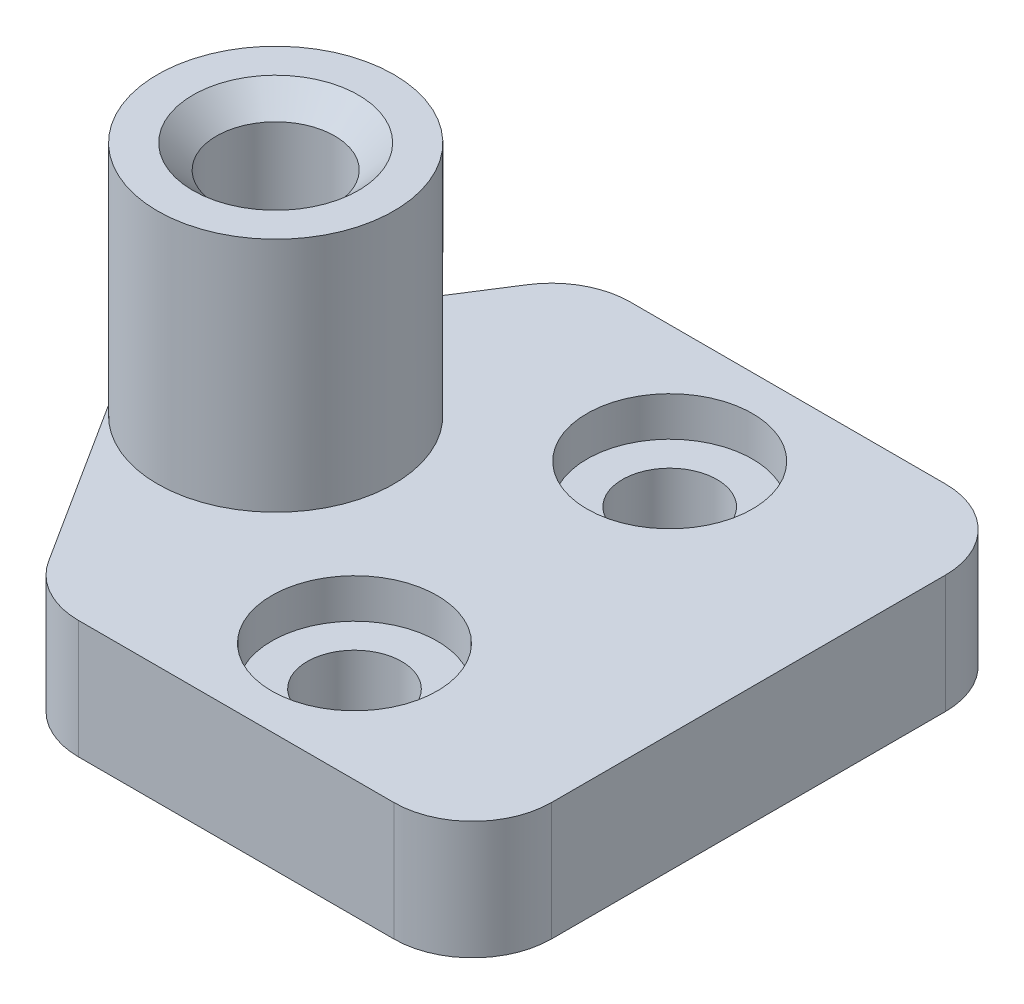
ISO-10303-21;
HEADER;
FILE_DESCRIPTION(('STEP AP214'),'2;1');
FILE_NAME('part.step','',(''),(''),'','','');
FILE_SCHEMA(('AUTOMOTIVE_DESIGN { 1 0 10303 214 1 1 1 1 }'));
ENDSEC;
DATA;
#1=APPLICATION_CONTEXT('core data for automotive mechanical design processes');
#2=APPLICATION_PROTOCOL_DEFINITION('international standard','automotive_design',2000,#1);
#3=PRODUCT_CONTEXT('',#1,'mechanical');
#4=PRODUCT('Part','Part','',(#3));
#5=PRODUCT_RELATED_PRODUCT_CATEGORY('part','',(#4));
#6=PRODUCT_DEFINITION_FORMATION('','',#4);
#7=PRODUCT_DEFINITION_CONTEXT('part definition',#1,'design');
#8=PRODUCT_DEFINITION('design','',#6,#7);
#9=PRODUCT_DEFINITION_SHAPE('','',#8);
#10=(LENGTH_UNIT() NAMED_UNIT(*) SI_UNIT(.MILLI.,.METRE.));
#11=(NAMED_UNIT(*) PLANE_ANGLE_UNIT() SI_UNIT($,.RADIAN.));
#12=(NAMED_UNIT(*) SI_UNIT($,.STERADIAN.) SOLID_ANGLE_UNIT());
#13=UNCERTAINTY_MEASURE_WITH_UNIT(LENGTH_MEASURE(1.E-05),#10,'distance_accuracy_value','');
#14=(GEOMETRIC_REPRESENTATION_CONTEXT(3) GLOBAL_UNCERTAINTY_ASSIGNED_CONTEXT((#13)) GLOBAL_UNIT_ASSIGNED_CONTEXT((#10,
#11,#12)) REPRESENTATION_CONTEXT('',''));
#15=CARTESIAN_POINT('',(0.,0.,0.));
#16=DIRECTION('',(0.,0.,1.));
#17=DIRECTION('',(1.,0.,0.));
#18=AXIS2_PLACEMENT_3D('',#15,#16,#17);
#19=CARTESIAN_POINT('',(0.,3.,-4.));
#20=DIRECTION('',(0.,-1.,0.));
#21=DIRECTION('',(0.,0.,-1.));
#22=AXIS2_PLACEMENT_3D('',#19,#20,#21);
#23=CYLINDRICAL_SURFACE('',#22,1.2);
#24=CARTESIAN_POINT('',(0.,0.,-4.));
#25=DIRECTION('',(0.,1.,0.));
#26=DIRECTION('',(0.,0.,1.));
#27=AXIS2_PLACEMENT_3D('',#24,#25,#26);
#28=CIRCLE('',#27,1.2);
#29=CARTESIAN_POINT('',(0.,0.,-2.8));
#30=VERTEX_POINT('',#29);
#31=EDGE_CURVE('E276',#30,#30,#28,.T.);
#32=ORIENTED_EDGE('',*,*,#31,.F.);
#33=EDGE_LOOP('',(#32));
#34=FACE_BOUND('',#33,.T.);
#35=CARTESIAN_POINT('',(0.,2.,-4.));
#36=DIRECTION('',(0.,1.,0.));
#37=DIRECTION('',(0.,0.,1.));
#38=AXIS2_PLACEMENT_3D('',#35,#36,#37);
#39=CIRCLE('',#38,1.2);
#40=CARTESIAN_POINT('',(0.,2.,-2.8));
#41=VERTEX_POINT('',#40);
#42=EDGE_CURVE('E158',#41,#41,#39,.T.);
#43=ORIENTED_EDGE('',*,*,#42,.T.);
#44=EDGE_LOOP('',(#43));
#45=FACE_BOUND('',#44,.T.);
#46=ADVANCED_FACE('F41',(#34,#45),#23,.F.);
#47=CARTESIAN_POINT('',(0.,3.,4.));
#48=DIRECTION('',(0.,-1.,0.));
#49=DIRECTION('',(0.,0.,-1.));
#50=AXIS2_PLACEMENT_3D('',#47,#48,#49);
#51=CYLINDRICAL_SURFACE('',#50,1.2);
#52=CARTESIAN_POINT('',(0.,0.,4.));
#53=DIRECTION('',(0.,1.,0.));
#54=DIRECTION('',(0.,0.,1.));
#55=AXIS2_PLACEMENT_3D('',#52,#53,#54);
#56=CIRCLE('',#55,1.2);
#57=CARTESIAN_POINT('',(0.,0.,5.2));
#58=VERTEX_POINT('',#57);
#59=EDGE_CURVE('E282',#58,#58,#56,.T.);
#60=ORIENTED_EDGE('',*,*,#59,.F.);
#61=EDGE_LOOP('',(#60));
#62=FACE_BOUND('',#61,.T.);
#63=CARTESIAN_POINT('',(0.,2.,4.));
#64=DIRECTION('',(0.,1.,0.));
#65=DIRECTION('',(0.,0.,1.));
#66=AXIS2_PLACEMENT_3D('',#63,#64,#65);
#67=CIRCLE('',#66,1.2);
#68=CARTESIAN_POINT('',(0.,2.,5.2));
#69=VERTEX_POINT('',#68);
#70=EDGE_CURVE('E155',#69,#69,#67,.T.);
#71=ORIENTED_EDGE('',*,*,#70,.T.);
#72=EDGE_LOOP('',(#71));
#73=FACE_BOUND('',#72,.T.);
#74=ADVANCED_FACE('F179',(#62,#73),#51,.F.);
#75=CARTESIAN_POINT('',(-6.,-8.48528137423857,0.));
#76=DIRECTION('',(0.,1.,0.));
#77=DIRECTION('',(0.,0.,1.));
#78=AXIS2_PLACEMENT_3D('',#75,#76,#77);
#79=CYLINDRICAL_SURFACE('',#78,3.);
#80=CARTESIAN_POINT('',(-6.,9.,0.));
#81=DIRECTION('',(0.,1.,0.));
#82=DIRECTION('',(0.,0.,1.));
#83=AXIS2_PLACEMENT_3D('',#80,#81,#82);
#84=CIRCLE('',#83,3.);
#85=CARTESIAN_POINT('',(-6.,9.,3.));
#86=VERTEX_POINT('',#85);
#87=EDGE_CURVE('E289',#86,#86,#84,.T.);
#88=ORIENTED_EDGE('',*,*,#87,.F.);
#89=EDGE_LOOP('',(#88));
#90=FACE_BOUND('',#89,.T.);
#91=CARTESIAN_POINT('',(-6.,3.,0.));
#92=DIRECTION('',(0.,1.,0.));
#93=DIRECTION('',(0.,0.,1.));
#94=AXIS2_PLACEMENT_3D('',#91,#92,#93);
#95=CIRCLE('',#94,3.);
#96=CARTESIAN_POINT('',(-8.53008756317027,3.,1.61203502526811));
#97=VERTEX_POINT('',#96);
#98=CARTESIAN_POINT('',(-8.53008756317027,3.,-1.61203502526811));
#99=VERTEX_POINT('',#98);
#100=EDGE_CURVE('E285',#97,#99,#95,.T.);
#101=ORIENTED_EDGE('',*,*,#100,.T.);
#102=DIRECTION('',(0.,1.,0.));
#103=VECTOR('',#102,1.);
#104=CARTESIAN_POINT('',(-8.53008756317027,-5.29150262212918,-1.61203502526811));
#105=LINE('',#104,#103);
#106=CARTESIAN_POINT('',(-8.53008756317027,0.,-1.61203502526811));
#107=VERTEX_POINT('',#106);
#108=EDGE_CURVE('E123',#107,#99,#105,.T.);
#109=ORIENTED_EDGE('',*,*,#108,.F.);
#110=CARTESIAN_POINT('',(-6.,0.,0.));
#111=DIRECTION('',(0.,1.,0.));
#112=DIRECTION('',(0.,0.,1.));
#113=AXIS2_PLACEMENT_3D('',#110,#111,#112);
#114=CIRCLE('',#113,3.);
#115=CARTESIAN_POINT('',(-8.53008756317027,0.,1.61203502526811));
#116=VERTEX_POINT('',#115);
#117=EDGE_CURVE('E287',#116,#107,#114,.F.);
#118=ORIENTED_EDGE('',*,*,#117,.F.);
#119=DIRECTION('',(0.,1.,0.));
#120=VECTOR('',#119,1.);
#121=CARTESIAN_POINT('',(-8.53008756317027,-5.29150262212918,1.61203502526811));
#122=LINE('',#121,#120);
#123=EDGE_CURVE('E239',#116,#97,#122,.T.);
#124=ORIENTED_EDGE('',*,*,#123,.T.);
#125=EDGE_LOOP('',(#101,#109,#118,#124));
#126=FACE_BOUND('',#125,.T.);
#127=ADVANCED_FACE('F186',(#90,#126),#79,.T.);
#128=CARTESIAN_POINT('',(-4.,3.,-5.));
#129=DIRECTION('',(0.,-1.,0.));
#130=DIRECTION('',(0.,0.,-1.));
#131=AXIS2_PLACEMENT_3D('',#128,#129,#130);
#132=CYLINDRICAL_SURFACE('',#131,2.);
#133=CARTESIAN_POINT('',(-4.,0.,-5.));
#134=DIRECTION('',(0.,1.,0.));
#135=DIRECTION('',(0.,0.,1.));
#136=AXIS2_PLACEMENT_3D('',#133,#134,#135);
#137=CIRCLE('',#136,2.);
#138=CARTESIAN_POINT('',(-5.68672504211351,0.,-6.07469001684541));
#139=VERTEX_POINT('',#138);
#140=CARTESIAN_POINT('',(-4.,0.,-7.));
#141=VERTEX_POINT('',#140);
#142=EDGE_CURVE('E134',#139,#141,#137,.F.);
#143=ORIENTED_EDGE('',*,*,#142,.F.);
#144=DIRECTION('',(0.,1.,0.));
#145=VECTOR('',#144,1.);
#146=CARTESIAN_POINT('',(-5.68672504211351,-5.29150262212918,-6.0746900168454));
#147=LINE('',#146,#145);
#148=CARTESIAN_POINT('',(-5.68672504211351,3.,-6.0746900168454));
#149=VERTEX_POINT('',#148);
#150=EDGE_CURVE('E57',#139,#149,#147,.T.);
#151=ORIENTED_EDGE('',*,*,#150,.T.);
#152=CARTESIAN_POINT('',(-4.,3.,-5.));
#153=DIRECTION('',(0.,1.,0.));
#154=DIRECTION('',(0.,0.,1.));
#155=AXIS2_PLACEMENT_3D('',#152,#153,#154);
#156=CIRCLE('',#155,2.);
#157=CARTESIAN_POINT('',(-4.,3.,-7.));
#158=VERTEX_POINT('',#157);
#159=EDGE_CURVE('E133',#158,#149,#156,.T.);
#160=ORIENTED_EDGE('',*,*,#159,.F.);
#161=DIRECTION('',(0.,-1.,0.));
#162=VECTOR('',#161,1.);
#163=CARTESIAN_POINT('',(-4.,3.,-7.));
#164=LINE('',#163,#162);
#165=EDGE_CURVE('E262',#141,#158,#164,.F.);
#166=ORIENTED_EDGE('',*,*,#165,.F.);
#167=EDGE_LOOP('',(#143,#151,#160,#166));
#168=FACE_BOUND('',#167,.T.);
#169=ADVANCED_FACE('F131',(#168),#132,.T.);
#170=CARTESIAN_POINT('',(0.,3.,0.));
#171=DIRECTION('',(0.,1.,0.));
#172=DIRECTION('',(0.,0.,1.));
#173=AXIS2_PLACEMENT_3D('',#170,#171,#172);
#174=PLANE('',#173);
#175=CARTESIAN_POINT('',(0.,3.,-4.));
#176=DIRECTION('',(0.,1.,0.));
#177=DIRECTION('',(0.,0.,1.));
#178=AXIS2_PLACEMENT_3D('',#175,#176,#177);
#179=CIRCLE('',#178,2.1);
#180=CARTESIAN_POINT('',(0.,3.,-1.9));
#181=VERTEX_POINT('',#180);
#182=EDGE_CURVE('E306',#181,#181,#179,.T.);
#183=ORIENTED_EDGE('',*,*,#182,.F.);
#184=EDGE_LOOP('',(#183));
#185=FACE_BOUND('',#184,.T.);
#186=CARTESIAN_POINT('',(0.,3.,4.));
#187=DIRECTION('',(0.,1.,0.));
#188=DIRECTION('',(0.,0.,1.));
#189=AXIS2_PLACEMENT_3D('',#186,#187,#188);
#190=CIRCLE('',#189,2.1);
#191=CARTESIAN_POINT('',(0.,3.,6.1));
#192=VERTEX_POINT('',#191);
#193=EDGE_CURVE('E302',#192,#192,#190,.T.);
#194=ORIENTED_EDGE('',*,*,#193,.F.);
#195=EDGE_LOOP('',(#194));
#196=FACE_BOUND('',#195,.T.);
#197=DIRECTION('',(-0.537345008422702,0.,0.843362521056755));
#198=VECTOR('',#197,1.);
#199=CARTESIAN_POINT('',(-8.53008756317027,3.,-1.61203502526811));
#200=LINE('',#199,#198);
#201=EDGE_CURVE('E120',#149,#99,#200,.T.);
#202=ORIENTED_EDGE('',*,*,#201,.T.);
#203=ORIENTED_EDGE('',*,*,#100,.F.);
#204=DIRECTION('',(0.537345008422702,0.,0.843362521056755));
#205=VECTOR('',#204,1.);
#206=CARTESIAN_POINT('',(-8.53008756317027,3.,1.61203502526811));
#207=LINE('',#206,#205);
#208=CARTESIAN_POINT('',(-5.68672504211351,3.,6.0746900168454));
#209=VERTEX_POINT('',#208);
#210=EDGE_CURVE('E126',#97,#209,#207,.T.);
#211=ORIENTED_EDGE('',*,*,#210,.T.);
#212=CARTESIAN_POINT('',(-4.,3.,5.));
#213=DIRECTION('',(0.,1.,0.));
#214=DIRECTION('',(0.,0.,1.));
#215=AXIS2_PLACEMENT_3D('',#212,#213,#214);
#216=CIRCLE('',#215,2.);
#217=CARTESIAN_POINT('',(-4.,3.,7.));
#218=VERTEX_POINT('',#217);
#219=EDGE_CURVE('E236',#209,#218,#216,.T.);
#220=ORIENTED_EDGE('',*,*,#219,.T.);
#221=DIRECTION('',(1.,0.,0.));
#222=VECTOR('',#221,1.);
#223=CARTESIAN_POINT('',(-6.,3.,7.));
#224=LINE('',#223,#222);
#225=CARTESIAN_POINT('',(4.,3.,7.));
#226=VERTEX_POINT('',#225);
#227=EDGE_CURVE('E248',#218,#226,#224,.T.);
#228=ORIENTED_EDGE('',*,*,#227,.T.);
#229=CARTESIAN_POINT('',(4.,3.,5.));
#230=DIRECTION('',(0.,1.,0.));
#231=DIRECTION('',(0.,0.,1.));
#232=AXIS2_PLACEMENT_3D('',#229,#230,#231);
#233=CIRCLE('',#232,2.);
#234=CARTESIAN_POINT('',(6.,3.,5.));
#235=VERTEX_POINT('',#234);
#236=EDGE_CURVE('E145',#226,#235,#233,.T.);
#237=ORIENTED_EDGE('',*,*,#236,.T.);
#238=DIRECTION('',(0.,0.,-1.));
#239=VECTOR('',#238,1.);
#240=CARTESIAN_POINT('',(6.,3.,-7.));
#241=LINE('',#240,#239);
#242=CARTESIAN_POINT('',(6.,3.,-5.));
#243=VERTEX_POINT('',#242);
#244=EDGE_CURVE('E265',#235,#243,#241,.T.);
#245=ORIENTED_EDGE('',*,*,#244,.T.);
#246=CARTESIAN_POINT('',(4.,3.,-5.));
#247=DIRECTION('',(0.,1.,0.));
#248=DIRECTION('',(0.,0.,1.));
#249=AXIS2_PLACEMENT_3D('',#246,#247,#248);
#250=CIRCLE('',#249,2.);
#251=CARTESIAN_POINT('',(4.,3.,-7.));
#252=VERTEX_POINT('',#251);
#253=EDGE_CURVE('E141',#243,#252,#250,.T.);
#254=ORIENTED_EDGE('',*,*,#253,.T.);
#255=DIRECTION('',(-1.,0.,0.));
#256=VECTOR('',#255,1.);
#257=CARTESIAN_POINT('',(-6.,3.,-7.));
#258=LINE('',#257,#256);
#259=EDGE_CURVE('E139',#252,#158,#258,.T.);
#260=ORIENTED_EDGE('',*,*,#259,.T.);
#261=ORIENTED_EDGE('',*,*,#159,.T.);
#262=EDGE_LOOP('',(#202,#203,#211,#220,#228,#237,#245,#254,#260,#261));
#263=FACE_BOUND('',#262,.T.);
#264=ADVANCED_FACE('F137',(#185,#196,#263),#174,.T.);
#265=CARTESIAN_POINT('',(0.,0.,0.));
#266=DIRECTION('',(0.,1.,0.));
#267=DIRECTION('',(0.,0.,1.));
#268=AXIS2_PLACEMENT_3D('',#265,#266,#267);
#269=PLANE('',#268);
#270=ORIENTED_EDGE('',*,*,#117,.T.);
#271=DIRECTION('',(0.537345008422702,0.,-0.843362521056755));
#272=VECTOR('',#271,1.);
#273=CARTESIAN_POINT('',(-8.53008756317027,0.,-1.61203502526811));
#274=LINE('',#273,#272);
#275=EDGE_CURVE('E292',#107,#139,#274,.T.);
#276=ORIENTED_EDGE('',*,*,#275,.T.);
#277=ORIENTED_EDGE('',*,*,#142,.T.);
#278=DIRECTION('',(-1.,0.,0.));
#279=VECTOR('',#278,1.);
#280=CARTESIAN_POINT('',(-6.,0.,-7.));
#281=LINE('',#280,#279);
#282=CARTESIAN_POINT('',(4.,0.,-7.));
#283=VERTEX_POINT('',#282);
#284=EDGE_CURVE('E273',#283,#141,#281,.T.);
#285=ORIENTED_EDGE('',*,*,#284,.F.);
#286=CARTESIAN_POINT('',(4.,0.,-5.));
#287=DIRECTION('',(0.,1.,0.));
#288=DIRECTION('',(0.,0.,1.));
#289=AXIS2_PLACEMENT_3D('',#286,#287,#288);
#290=CIRCLE('',#289,2.);
#291=CARTESIAN_POINT('',(6.,0.,-5.));
#292=VERTEX_POINT('',#291);
#293=EDGE_CURVE('E250',#283,#292,#290,.F.);
#294=ORIENTED_EDGE('',*,*,#293,.T.);
#295=DIRECTION('',(0.,0.,-1.));
#296=VECTOR('',#295,1.);
#297=CARTESIAN_POINT('',(6.,0.,-7.));
#298=LINE('',#297,#296);
#299=CARTESIAN_POINT('',(6.,0.,5.));
#300=VERTEX_POINT('',#299);
#301=EDGE_CURVE('E272',#300,#292,#298,.T.);
#302=ORIENTED_EDGE('',*,*,#301,.F.);
#303=CARTESIAN_POINT('',(4.,0.,5.));
#304=DIRECTION('',(0.,1.,0.));
#305=DIRECTION('',(0.,0.,1.));
#306=AXIS2_PLACEMENT_3D('',#303,#304,#305);
#307=CIRCLE('',#306,2.);
#308=CARTESIAN_POINT('',(4.,0.,7.));
#309=VERTEX_POINT('',#308);
#310=EDGE_CURVE('E247',#300,#309,#307,.F.);
#311=ORIENTED_EDGE('',*,*,#310,.T.);
#312=DIRECTION('',(1.,0.,0.));
#313=VECTOR('',#312,1.);
#314=CARTESIAN_POINT('',(-6.,0.,7.));
#315=LINE('',#314,#313);
#316=CARTESIAN_POINT('',(-4.,0.,7.));
#317=VERTEX_POINT('',#316);
#318=EDGE_CURVE('E246',#317,#309,#315,.T.);
#319=ORIENTED_EDGE('',*,*,#318,.F.);
#320=CARTESIAN_POINT('',(-4.,0.,5.));
#321=DIRECTION('',(0.,1.,0.));
#322=DIRECTION('',(0.,0.,1.));
#323=AXIS2_PLACEMENT_3D('',#320,#321,#322);
#324=CIRCLE('',#323,2.);
#325=CARTESIAN_POINT('',(-5.68672504211351,0.,6.0746900168454));
#326=VERTEX_POINT('',#325);
#327=EDGE_CURVE('E235',#317,#326,#324,.F.);
#328=ORIENTED_EDGE('',*,*,#327,.T.);
#329=DIRECTION('',(-0.537345008422702,0.,-0.843362521056755));
#330=VECTOR('',#329,1.);
#331=CARTESIAN_POINT('',(-8.53008756317027,0.,1.61203502526811));
#332=LINE('',#331,#330);
#333=EDGE_CURVE('E161',#326,#116,#332,.T.);
#334=ORIENTED_EDGE('',*,*,#333,.T.);
#335=EDGE_LOOP('',(#270,#276,#277,#285,#294,#302,#311,#319,#328,#334));
#336=FACE_BOUND('',#335,.T.);
#337=ORIENTED_EDGE('',*,*,#31,.T.);
#338=EDGE_LOOP('',(#337));
#339=FACE_BOUND('',#338,.T.);
#340=ORIENTED_EDGE('',*,*,#59,.T.);
#341=EDGE_LOOP('',(#340));
#342=FACE_BOUND('',#341,.T.);
#343=ADVANCED_FACE('F195',(#336,#339,#342),#269,.F.);
#344=CARTESIAN_POINT('',(6.,3.,-7.));
#345=DIRECTION('',(-1.,0.,0.));
#346=DIRECTION('',(0.,0.,1.));
#347=AXIS2_PLACEMENT_3D('',#344,#345,#346);
#348=PLANE('',#347);
#349=ORIENTED_EDGE('',*,*,#301,.T.);
#350=DIRECTION('',(0.,-1.,0.));
#351=VECTOR('',#350,1.);
#352=CARTESIAN_POINT('',(6.,3.,-5.));
#353=LINE('',#352,#351);
#354=EDGE_CURVE('E65',#292,#243,#353,.F.);
#355=ORIENTED_EDGE('',*,*,#354,.T.);
#356=ORIENTED_EDGE('',*,*,#244,.F.);
#357=DIRECTION('',(0.,-1.,0.));
#358=VECTOR('',#357,1.);
#359=CARTESIAN_POINT('',(6.,3.,5.));
#360=LINE('',#359,#358);
#361=EDGE_CURVE('E140',#235,#300,#360,.T.);
#362=ORIENTED_EDGE('',*,*,#361,.T.);
#363=EDGE_LOOP('',(#349,#355,#356,#362));
#364=FACE_BOUND('',#363,.T.);
#365=ADVANCED_FACE('F199',(#364),#348,.F.);
#366=CARTESIAN_POINT('',(-6.,3.,-7.));
#367=DIRECTION('',(0.,0.,1.));
#368=DIRECTION('',(1.,0.,0.));
#369=AXIS2_PLACEMENT_3D('',#366,#367,#368);
#370=PLANE('',#369);
#371=ORIENTED_EDGE('',*,*,#284,.T.);
#372=ORIENTED_EDGE('',*,*,#165,.T.);
#373=ORIENTED_EDGE('',*,*,#259,.F.);
#374=DIRECTION('',(0.,-1.,0.));
#375=VECTOR('',#374,1.);
#376=CARTESIAN_POINT('',(4.,3.,-7.));
#377=LINE('',#376,#375);
#378=EDGE_CURVE('E259',#252,#283,#377,.T.);
#379=ORIENTED_EDGE('',*,*,#378,.T.);
#380=EDGE_LOOP('',(#371,#372,#373,#379));
#381=FACE_BOUND('',#380,.T.);
#382=ADVANCED_FACE('F205',(#381),#370,.F.);
#383=CARTESIAN_POINT('',(-6.,3.,7.));
#384=DIRECTION('',(0.,0.,-1.));
#385=DIRECTION('',(-1.,0.,0.));
#386=AXIS2_PLACEMENT_3D('',#383,#384,#385);
#387=PLANE('',#386);
#388=ORIENTED_EDGE('',*,*,#318,.T.);
#389=DIRECTION('',(0.,-1.,0.));
#390=VECTOR('',#389,1.);
#391=CARTESIAN_POINT('',(4.,3.,7.));
#392=LINE('',#391,#390);
#393=EDGE_CURVE('E153',#309,#226,#392,.F.);
#394=ORIENTED_EDGE('',*,*,#393,.T.);
#395=ORIENTED_EDGE('',*,*,#227,.F.);
#396=DIRECTION('',(0.,-1.,0.));
#397=VECTOR('',#396,1.);
#398=CARTESIAN_POINT('',(-4.,3.,7.));
#399=LINE('',#398,#397);
#400=EDGE_CURVE('E150',#218,#317,#399,.T.);
#401=ORIENTED_EDGE('',*,*,#400,.T.);
#402=EDGE_LOOP('',(#388,#394,#395,#401));
#403=FACE_BOUND('',#402,.T.);
#404=ADVANCED_FACE('F201',(#403),#387,.F.);
#405=CARTESIAN_POINT('',(-6.,9.,0.));
#406=DIRECTION('',(0.,1.,0.));
#407=DIRECTION('',(0.,0.,1.));
#408=AXIS2_PLACEMENT_3D('',#405,#406,#407);
#409=PLANE('',#408);
#410=CARTESIAN_POINT('',(-6.,9.,0.));
#411=DIRECTION('',(0.,1.,0.));
#412=DIRECTION('',(0.,0.,1.));
#413=AXIS2_PLACEMENT_3D('',#410,#411,#412);
#414=CIRCLE('',#413,2.1);
#415=CARTESIAN_POINT('',(-6.,9.,2.1));
#416=VERTEX_POINT('',#415);
#417=EDGE_CURVE('E11',#416,#416,#414,.F.);
#418=ORIENTED_EDGE('',*,*,#417,.T.);
#419=EDGE_LOOP('',(#418));
#420=FACE_BOUND('',#419,.T.);
#421=ORIENTED_EDGE('',*,*,#87,.T.);
#422=EDGE_LOOP('',(#421));
#423=FACE_BOUND('',#422,.T.);
#424=ADVANCED_FACE('F204',(#420,#423),#409,.T.);
#425=CARTESIAN_POINT('',(4.,3.,-5.));
#426=DIRECTION('',(0.,-1.,0.));
#427=DIRECTION('',(0.,0.,-1.));
#428=AXIS2_PLACEMENT_3D('',#425,#426,#427);
#429=CYLINDRICAL_SURFACE('',#428,2.);
#430=ORIENTED_EDGE('',*,*,#253,.F.);
#431=ORIENTED_EDGE('',*,*,#354,.F.);
#432=ORIENTED_EDGE('',*,*,#293,.F.);
#433=ORIENTED_EDGE('',*,*,#378,.F.);
#434=EDGE_LOOP('',(#430,#431,#432,#433));
#435=FACE_BOUND('',#434,.T.);
#436=ADVANCED_FACE('F214',(#435),#429,.T.);
#437=CARTESIAN_POINT('',(4.,3.,5.));
#438=DIRECTION('',(0.,-1.,0.));
#439=DIRECTION('',(0.,0.,-1.));
#440=AXIS2_PLACEMENT_3D('',#437,#438,#439);
#441=CYLINDRICAL_SURFACE('',#440,2.);
#442=ORIENTED_EDGE('',*,*,#236,.F.);
#443=ORIENTED_EDGE('',*,*,#393,.F.);
#444=ORIENTED_EDGE('',*,*,#310,.F.);
#445=ORIENTED_EDGE('',*,*,#361,.F.);
#446=EDGE_LOOP('',(#442,#443,#444,#445));
#447=FACE_BOUND('',#446,.T.);
#448=ADVANCED_FACE('F217',(#447),#441,.T.);
#449=CARTESIAN_POINT('',(-4.,3.,5.));
#450=DIRECTION('',(0.,-1.,0.));
#451=DIRECTION('',(0.,0.,-1.));
#452=AXIS2_PLACEMENT_3D('',#449,#450,#451);
#453=CYLINDRICAL_SURFACE('',#452,2.);
#454=DIRECTION('',(0.,1.,0.));
#455=VECTOR('',#454,1.);
#456=CARTESIAN_POINT('',(-5.68672504211351,-5.29150262212918,6.0746900168454));
#457=LINE('',#456,#455);
#458=EDGE_CURVE('E232',#326,#209,#457,.T.);
#459=ORIENTED_EDGE('',*,*,#458,.F.);
#460=ORIENTED_EDGE('',*,*,#327,.F.);
#461=ORIENTED_EDGE('',*,*,#400,.F.);
#462=ORIENTED_EDGE('',*,*,#219,.F.);
#463=EDGE_LOOP('',(#459,#460,#461,#462));
#464=FACE_BOUND('',#463,.T.);
#465=ADVANCED_FACE('F220',(#464),#453,.T.);
#466=CARTESIAN_POINT('',(-8.53008756317027,-5.29150262212918,1.61203502526811));
#467=DIRECTION('',(-0.843362521056755,0.,0.537345008422702));
#468=DIRECTION('',(0.537345008422702,0.,0.843362521056755));
#469=AXIS2_PLACEMENT_3D('',#466,#467,#468);
#470=PLANE('',#469);
#471=ORIENTED_EDGE('',*,*,#333,.F.);
#472=ORIENTED_EDGE('',*,*,#458,.T.);
#473=ORIENTED_EDGE('',*,*,#210,.F.);
#474=ORIENTED_EDGE('',*,*,#123,.F.);
#475=EDGE_LOOP('',(#471,#472,#473,#474));
#476=FACE_BOUND('',#475,.T.);
#477=ADVANCED_FACE('F223',(#476),#470,.T.);
#478=CARTESIAN_POINT('',(-8.53008756317027,-5.29150262212918,-1.61203502526811));
#479=DIRECTION('',(-0.843362521056755,0.,-0.537345008422702));
#480=DIRECTION('',(-0.537345008422702,0.,0.843362521056755));
#481=AXIS2_PLACEMENT_3D('',#478,#479,#480);
#482=PLANE('',#481);
#483=ORIENTED_EDGE('',*,*,#275,.F.);
#484=ORIENTED_EDGE('',*,*,#108,.T.);
#485=ORIENTED_EDGE('',*,*,#201,.F.);
#486=ORIENTED_EDGE('',*,*,#150,.F.);
#487=EDGE_LOOP('',(#483,#484,#485,#486));
#488=FACE_BOUND('',#487,.T.);
#489=ADVANCED_FACE('F121',(#488),#482,.T.);
#490=CARTESIAN_POINT('',(0.,2.,4.));
#491=DIRECTION('',(0.,1.,0.));
#492=DIRECTION('',(0.,0.,1.));
#493=AXIS2_PLACEMENT_3D('',#490,#491,#492);
#494=CYLINDRICAL_SURFACE('',#493,2.1);
#495=CARTESIAN_POINT('',(0.,2.,4.));
#496=DIRECTION('',(0.,1.,0.));
#497=DIRECTION('',(0.,0.,1.));
#498=AXIS2_PLACEMENT_3D('',#495,#496,#497);
#499=CIRCLE('',#498,2.1);
#500=CARTESIAN_POINT('',(0.,2.,6.1));
#501=VERTEX_POINT('',#500);
#502=EDGE_CURVE('E299',#501,#501,#499,.T.);
#503=ORIENTED_EDGE('',*,*,#502,.F.);
#504=EDGE_LOOP('',(#503));
#505=FACE_BOUND('',#504,.T.);
#506=ORIENTED_EDGE('',*,*,#193,.T.);
#507=EDGE_LOOP('',(#506));
#508=FACE_BOUND('',#507,.T.);
#509=ADVANCED_FACE('F327',(#505,#508),#494,.F.);
#510=CARTESIAN_POINT('',(0.,2.,4.));
#511=DIRECTION('',(0.,1.,0.));
#512=DIRECTION('',(0.,0.,1.));
#513=AXIS2_PLACEMENT_3D('',#510,#511,#512);
#514=PLANE('',#513);
#515=ORIENTED_EDGE('',*,*,#70,.F.);
#516=EDGE_LOOP('',(#515));
#517=FACE_BOUND('',#516,.T.);
#518=ORIENTED_EDGE('',*,*,#502,.T.);
#519=EDGE_LOOP('',(#518));
#520=FACE_BOUND('',#519,.T.);
#521=ADVANCED_FACE('F325',(#517,#520),#514,.T.);
#522=CARTESIAN_POINT('',(0.,2.,-4.));
#523=DIRECTION('',(0.,1.,0.));
#524=DIRECTION('',(0.,0.,1.));
#525=AXIS2_PLACEMENT_3D('',#522,#523,#524);
#526=CYLINDRICAL_SURFACE('',#525,2.1);
#527=CARTESIAN_POINT('',(0.,2.,-4.));
#528=DIRECTION('',(0.,1.,0.));
#529=DIRECTION('',(0.,0.,1.));
#530=AXIS2_PLACEMENT_3D('',#527,#528,#529);
#531=CIRCLE('',#530,2.1);
#532=CARTESIAN_POINT('',(0.,2.,-1.9));
#533=VERTEX_POINT('',#532);
#534=EDGE_CURVE('E159',#533,#533,#531,.T.);
#535=ORIENTED_EDGE('',*,*,#534,.F.);
#536=EDGE_LOOP('',(#535));
#537=FACE_BOUND('',#536,.T.);
#538=ORIENTED_EDGE('',*,*,#182,.T.);
#539=EDGE_LOOP('',(#538));
#540=FACE_BOUND('',#539,.T.);
#541=ADVANCED_FACE('F319',(#537,#540),#526,.F.);
#542=CARTESIAN_POINT('',(0.,2.,-4.));
#543=DIRECTION('',(0.,1.,0.));
#544=DIRECTION('',(0.,0.,1.));
#545=AXIS2_PLACEMENT_3D('',#542,#543,#544);
#546=PLANE('',#545);
#547=ORIENTED_EDGE('',*,*,#42,.F.);
#548=EDGE_LOOP('',(#547));
#549=FACE_BOUND('',#548,.T.);
#550=ORIENTED_EDGE('',*,*,#534,.T.);
#551=EDGE_LOOP('',(#550));
#552=FACE_BOUND('',#551,.T.);
#553=ADVANCED_FACE('F313',(#549,#552),#546,.T.);
#554=CARTESIAN_POINT('',(-6.,-1.24264068711928,0.));
#555=DIRECTION('',(0.,1.,0.));
#556=DIRECTION('',(0.,0.,1.));
#557=AXIS2_PLACEMENT_3D('',#554,#555,#556);
#558=CYLINDRICAL_SURFACE('',#557,1.5);
#559=CARTESIAN_POINT('',(-6.,8.4,0.));
#560=DIRECTION('',(0.,1.,0.));
#561=DIRECTION('',(0.,0.,1.));
#562=AXIS2_PLACEMENT_3D('',#559,#560,#561);
#563=CIRCLE('',#562,1.5);
#564=CARTESIAN_POINT('',(-6.,8.4,1.5));
#565=VERTEX_POINT('',#564);
#566=EDGE_CURVE('E50',#565,#565,#563,.T.);
#567=CARTESIAN_POINT('',(-6.,3.,0.));
#568=DIRECTION('',(0.,1.,0.));
#569=DIRECTION('',(0.,0.,1.));
#570=AXIS2_PLACEMENT_3D('',#567,#568,#569);
#571=CIRCLE('',#570,1.5);
#572=CARTESIAN_POINT('',(-6.,3.,1.5));
#573=VERTEX_POINT('',#572);
#574=EDGE_CURVE('E303',#573,#573,#571,.F.);
#575=CARTESIAN_POINT('',(-6.,8.4,1.5));
#576=CARTESIAN_POINT('',(-6.,8.34374999999999,1.5));
#577=CARTESIAN_POINT('',(-6.,8.2875,1.5));
#578=CARTESIAN_POINT('',(-6.,8.175,1.5));
#579=CARTESIAN_POINT('',(-6.,8.11875,1.5));
#580=CARTESIAN_POINT('',(-6.,8.00625,1.5));
#581=CARTESIAN_POINT('',(-6.,7.95,1.5));
#582=CARTESIAN_POINT('',(-6.,7.8375,1.5));
#583=CARTESIAN_POINT('',(-6.,7.78125,1.5));
#584=CARTESIAN_POINT('',(-6.,7.66875,1.5));
#585=CARTESIAN_POINT('',(-6.,7.6125,1.5));
#586=CARTESIAN_POINT('',(-6.,7.5,1.5));
#587=CARTESIAN_POINT('',(-6.,7.44375,1.5));
#588=CARTESIAN_POINT('',(-6.,7.33125,1.5));
#589=CARTESIAN_POINT('',(-6.,7.275,1.5));
#590=CARTESIAN_POINT('',(-6.,7.1625,1.5));
#591=CARTESIAN_POINT('',(-6.,7.10625,1.5));
#592=CARTESIAN_POINT('',(-6.,6.99375,1.5));
#593=CARTESIAN_POINT('',(-6.,6.9375,1.5));
#594=CARTESIAN_POINT('',(-6.,6.825,1.5));
#595=CARTESIAN_POINT('',(-6.,6.76875,1.5));
#596=CARTESIAN_POINT('',(-6.,6.65625,1.5));
#597=CARTESIAN_POINT('',(-6.,6.6,1.5));
#598=CARTESIAN_POINT('',(-6.,6.4875,1.5));
#599=CARTESIAN_POINT('',(-6.,6.43125,1.5));
#600=CARTESIAN_POINT('',(-6.,6.31875,1.5));
#601=CARTESIAN_POINT('',(-6.,6.2625,1.5));
#602=CARTESIAN_POINT('',(-6.,6.15,1.5));
#603=CARTESIAN_POINT('',(-6.,6.09375,1.5));
#604=CARTESIAN_POINT('',(-6.,5.98125,1.5));
#605=CARTESIAN_POINT('',(-6.,5.925,1.5));
#606=CARTESIAN_POINT('',(-6.,5.8125,1.5));
#607=CARTESIAN_POINT('',(-6.,5.75625,1.5));
#608=CARTESIAN_POINT('',(-6.,5.64375,1.5));
#609=CARTESIAN_POINT('',(-6.,5.5875,1.5));
#610=CARTESIAN_POINT('',(-6.,5.475,1.5));
#611=CARTESIAN_POINT('',(-6.,5.41875,1.5));
#612=CARTESIAN_POINT('',(-6.,5.30625,1.5));
#613=CARTESIAN_POINT('',(-6.,5.25,1.5));
#614=CARTESIAN_POINT('',(-6.,5.1375,1.5));
#615=CARTESIAN_POINT('',(-6.,5.08125,1.5));
#616=CARTESIAN_POINT('',(-6.,4.96875,1.5));
#617=CARTESIAN_POINT('',(-6.,4.9125,1.5));
#618=CARTESIAN_POINT('',(-6.,4.8,1.5));
#619=CARTESIAN_POINT('',(-6.,4.74375,1.5));
#620=CARTESIAN_POINT('',(-6.,4.63125,1.5));
#621=CARTESIAN_POINT('',(-6.,4.575,1.5));
#622=CARTESIAN_POINT('',(-6.,4.4625,1.5));
#623=CARTESIAN_POINT('',(-6.,4.40625,1.5));
#624=CARTESIAN_POINT('',(-6.,4.29375,1.5));
#625=CARTESIAN_POINT('',(-6.,4.2375,1.5));
#626=CARTESIAN_POINT('',(-6.,4.125,1.5));
#627=CARTESIAN_POINT('',(-6.,4.06875,1.5));
#628=CARTESIAN_POINT('',(-6.,3.95625,1.5));
#629=CARTESIAN_POINT('',(-6.,3.9,1.5));
#630=CARTESIAN_POINT('',(-6.,3.7875,1.5));
#631=CARTESIAN_POINT('',(-6.,3.73125,1.5));
#632=CARTESIAN_POINT('',(-6.,3.61875,1.5));
#633=CARTESIAN_POINT('',(-6.,3.5625,1.5));
#634=CARTESIAN_POINT('',(-6.,3.45,1.5));
#635=CARTESIAN_POINT('',(-6.,3.39375,1.5));
#636=CARTESIAN_POINT('',(-6.,3.28125,1.5));
#637=CARTESIAN_POINT('',(-6.,3.225,1.5));
#638=CARTESIAN_POINT('',(-6.,3.1125,1.5));
#639=CARTESIAN_POINT('',(-6.,3.05625,1.5));
#640=CARTESIAN_POINT('',(-6.,3.,1.5));
#641=B_SPLINE_CURVE_WITH_KNOTS('',3,(#575,#576,#577,#578,#579,#580,#581,#582,#583,#584,#585,
#586,#587,#588,#589,#590,#591,#592,#593,#594,#595,#596,#597,#598,#599,#600,#601,#602,#603,#604,
#605,#606,#607,#608,#609,#610,#611,#612,#613,#614,#615,#616,#617,#618,#619,#620,#621,#622,#623,
#624,#625,#626,#627,#628,#629,#630,#631,#632,#633,#634,#635,#636,#637,#638,#639,#640),
.UNSPECIFIED.,.F.,.F.,(4,2,2,2,2,2,2,2,2,2,2,2,2,2,2,2,2,2,2,2,2,2,2,2,2,2,2,2,2,2,2,2,4),(0.,
0.168750000000001,0.337499999999999,0.50625,0.675,0.843749999999999,1.0125,1.18125,1.35,1.51875,
1.6875,1.85625,2.025,2.19375,2.3625,2.53125,2.7,2.86875,3.0375,3.20625,3.375,3.54375,3.7125,
3.88125,4.05,4.21875,4.3875,4.55625,4.725,4.89375,5.0625,5.23125,5.4),.UNSPECIFIED.);
#642=EDGE_CURVE('BSEAM165',#565,#573,#641,.T.);
#643=ORIENTED_EDGE('',*,*,#566,.T.);
#644=ORIENTED_EDGE('',*,*,#574,.T.);
#645=ORIENTED_EDGE('',*,*,#642,.T.);
#646=ORIENTED_EDGE('',*,*,#642,.F.);
#647=EDGE_LOOP('',(#643,#645,#644,#646));
#648=FACE_BOUND('',#647,.T.);
#649=ADVANCED_FACE('F165',(#648),#558,.F.);
#650=CARTESIAN_POINT('',(0.,3.,0.));
#651=DIRECTION('',(0.,1.,0.));
#652=DIRECTION('',(0.,0.,1.));
#653=AXIS2_PLACEMENT_3D('',#650,#651,#652);
#654=PLANE('',#653);
#655=ORIENTED_EDGE('',*,*,#574,.F.);
#656=EDGE_LOOP('',(#655));
#657=FACE_BOUND('',#656,.T.);
#658=ADVANCED_FACE('F169',(#657),#654,.T.);
#659=CARTESIAN_POINT('',(-6.,8.4,0.));
#660=DIRECTION('',(0.,1.,0.));
#661=DIRECTION('',(0.,0.,1.));
#662=AXIS2_PLACEMENT_3D('',#659,#660,#661);
#663=CONICAL_SURFACE('',#662,1.5,0.785398163397448);
#664=ORIENTED_EDGE('',*,*,#417,.F.);
#665=EDGE_LOOP('',(#664));
#666=FACE_BOUND('',#665,.T.);
#667=ORIENTED_EDGE('',*,*,#566,.F.);
#668=EDGE_LOOP('',(#667));
#669=FACE_BOUND('',#668,.T.);
#670=ADVANCED_FACE('F44',(#666,#669),#663,.F.);
#671=CLOSED_SHELL('',(#46,#74,#127,#169,#264,#343,#365,#382,#404,#424,#436,#448,#465,#477,#489,
#509,#521,#541,#553,#649,#658,#670));
#672=MANIFOLD_SOLID_BREP('B2',#671);
#673=ADVANCED_BREP_SHAPE_REPRESENTATION('',(#18,#672),#14);
#674=SHAPE_DEFINITION_REPRESENTATION(#9,#673);
ENDSEC;
END-ISO-10303-21;
